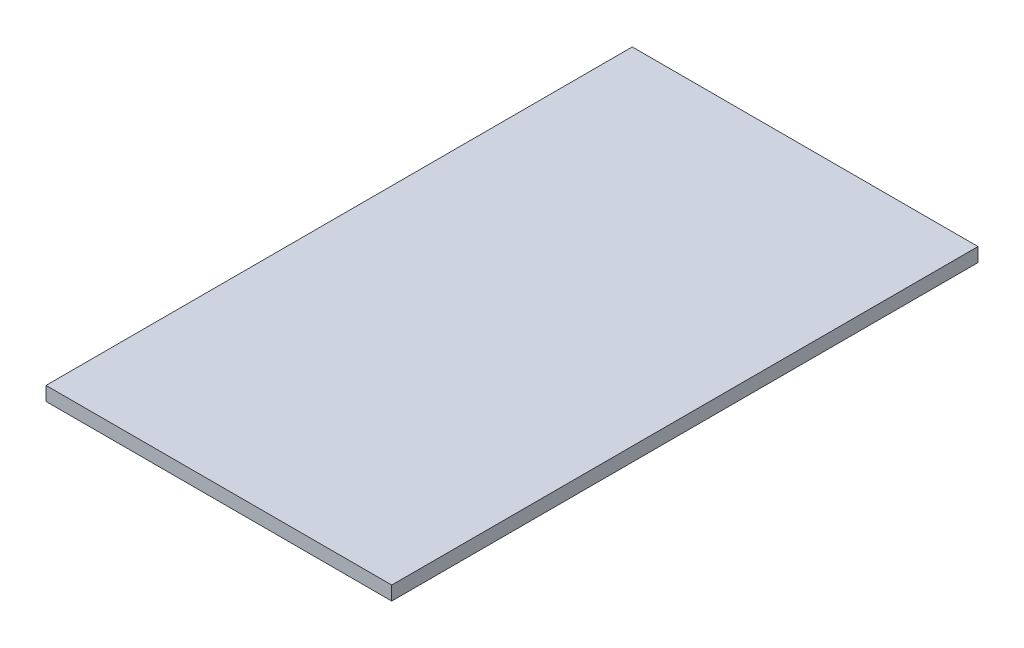
ISO-10303-21;
HEADER;
FILE_DESCRIPTION(('STEP AP214'),'2;1');
FILE_NAME('part.step','',(''),(''),'','','');
FILE_SCHEMA(('AUTOMOTIVE_DESIGN { 1 0 10303 214 1 1 1 1 }'));
ENDSEC;
DATA;
#1=APPLICATION_CONTEXT('core data for automotive mechanical design processes');
#2=APPLICATION_PROTOCOL_DEFINITION('international standard','automotive_design',2000,#1);
#3=PRODUCT_CONTEXT('',#1,'mechanical');
#4=PRODUCT('Part','Part','',(#3));
#5=PRODUCT_RELATED_PRODUCT_CATEGORY('part','',(#4));
#6=PRODUCT_DEFINITION_FORMATION('','',#4);
#7=PRODUCT_DEFINITION_CONTEXT('part definition',#1,'design');
#8=PRODUCT_DEFINITION('design','',#6,#7);
#9=PRODUCT_DEFINITION_SHAPE('','',#8);
#10=(LENGTH_UNIT() NAMED_UNIT(*) SI_UNIT(.MILLI.,.METRE.));
#11=(NAMED_UNIT(*) PLANE_ANGLE_UNIT() SI_UNIT($,.RADIAN.));
#12=(NAMED_UNIT(*) SI_UNIT($,.STERADIAN.) SOLID_ANGLE_UNIT());
#13=UNCERTAINTY_MEASURE_WITH_UNIT(LENGTH_MEASURE(1.E-05),#10,'distance_accuracy_value','');
#14=(GEOMETRIC_REPRESENTATION_CONTEXT(3) GLOBAL_UNCERTAINTY_ASSIGNED_CONTEXT((#13)) GLOBAL_UNIT_ASSIGNED_CONTEXT((#10,
#11,#12)) REPRESENTATION_CONTEXT('',''));
#15=CARTESIAN_POINT('',(0.,0.,0.));
#16=DIRECTION('',(0.,0.,1.));
#17=DIRECTION('',(1.,0.,0.));
#18=AXIS2_PLACEMENT_3D('',#15,#16,#17);
#19=CARTESIAN_POINT('',(24.3296303830655,6.35,0.));
#20=DIRECTION('',(1.,0.,0.));
#21=DIRECTION('',(0.,0.,-1.));
#22=AXIS2_PLACEMENT_3D('',#19,#20,#21);
#23=PLANE('',#22);
#24=DIRECTION('',(0.,0.,1.));
#25=VECTOR('',#24,1.);
#26=CARTESIAN_POINT('',(24.3296303830655,0.,0.));
#27=LINE('',#26,#25);
#28=CARTESIAN_POINT('',(24.3296303830655,0.,-267.462));
#29=VERTEX_POINT('',#28);
#30=CARTESIAN_POINT('',(24.3296303830655,0.,0.));
#31=VERTEX_POINT('',#30);
#32=EDGE_CURVE('E95',#29,#31,#27,.T.);
#33=ORIENTED_EDGE('',*,*,#32,.T.);
#34=DIRECTION('',(0.,-1.,0.));
#35=VECTOR('',#34,1.);
#36=CARTESIAN_POINT('',(24.3296303830655,6.35,0.));
#37=LINE('',#36,#35);
#38=CARTESIAN_POINT('',(24.3296303830655,6.35,0.));
#39=VERTEX_POINT('',#38);
#40=EDGE_CURVE('E11',#39,#31,#37,.T.);
#41=ORIENTED_EDGE('',*,*,#40,.F.);
#42=DIRECTION('',(0.,0.,1.));
#43=VECTOR('',#42,1.);
#44=CARTESIAN_POINT('',(24.3296303830655,6.35,0.));
#45=LINE('',#44,#43);
#46=CARTESIAN_POINT('',(24.3296303830655,6.35,-267.462));
#47=VERTEX_POINT('',#46);
#48=EDGE_CURVE('E83',#47,#39,#45,.T.);
#49=ORIENTED_EDGE('',*,*,#48,.F.);
#50=DIRECTION('',(0.,-1.,0.));
#51=VECTOR('',#50,1.);
#52=CARTESIAN_POINT('',(24.3296303830655,6.35,-267.462));
#53=LINE('',#52,#51);
#54=EDGE_CURVE('E91',#47,#29,#53,.T.);
#55=ORIENTED_EDGE('',*,*,#54,.T.);
#56=EDGE_LOOP('',(#33,#41,#49,#55));
#57=FACE_BOUND('',#56,.T.);
#58=ADVANCED_FACE('F32',(#57),#23,.F.);
#59=CARTESIAN_POINT('',(24.3296303830655,6.35,0.));
#60=DIRECTION('',(0.,0.,-1.));
#61=DIRECTION('',(-1.,0.,0.));
#62=AXIS2_PLACEMENT_3D('',#59,#60,#61);
#63=PLANE('',#62);
#64=DIRECTION('',(1.,0.,0.));
#65=VECTOR('',#64,1.);
#66=CARTESIAN_POINT('',(24.3296303830655,0.,0.));
#67=LINE('',#66,#65);
#68=CARTESIAN_POINT('',(182.063630383065,0.,0.));
#69=VERTEX_POINT('',#68);
#70=EDGE_CURVE('E87',#31,#69,#67,.T.);
#71=ORIENTED_EDGE('',*,*,#70,.T.);
#72=DIRECTION('',(0.,-1.,0.));
#73=VECTOR('',#72,1.);
#74=CARTESIAN_POINT('',(182.063630383065,6.35,0.));
#75=LINE('',#74,#73);
#76=CARTESIAN_POINT('',(182.063630383065,6.35,0.));
#77=VERTEX_POINT('',#76);
#78=EDGE_CURVE('E40',#77,#69,#75,.T.);
#79=ORIENTED_EDGE('',*,*,#78,.F.);
#80=DIRECTION('',(1.,0.,0.));
#81=VECTOR('',#80,1.);
#82=CARTESIAN_POINT('',(24.3296303830655,6.35,0.));
#83=LINE('',#82,#81);
#84=EDGE_CURVE('E78',#39,#77,#83,.T.);
#85=ORIENTED_EDGE('',*,*,#84,.F.);
#86=ORIENTED_EDGE('',*,*,#40,.T.);
#87=EDGE_LOOP('',(#71,#79,#85,#86));
#88=FACE_BOUND('',#87,.T.);
#89=ADVANCED_FACE('F86',(#88),#63,.F.);
#90=CARTESIAN_POINT('',(182.063630383065,6.35,0.));
#91=DIRECTION('',(-1.,0.,0.));
#92=DIRECTION('',(0.,0.,1.));
#93=AXIS2_PLACEMENT_3D('',#90,#91,#92);
#94=PLANE('',#93);
#95=DIRECTION('',(0.,0.,-1.));
#96=VECTOR('',#95,1.);
#97=CARTESIAN_POINT('',(182.063630383065,0.,0.));
#98=LINE('',#97,#96);
#99=CARTESIAN_POINT('',(182.063630383065,0.,-267.462));
#100=VERTEX_POINT('',#99);
#101=EDGE_CURVE('E65',#69,#100,#98,.T.);
#102=ORIENTED_EDGE('',*,*,#101,.T.);
#103=DIRECTION('',(0.,-1.,0.));
#104=VECTOR('',#103,1.);
#105=CARTESIAN_POINT('',(182.063630383065,6.35,-267.462));
#106=LINE('',#105,#104);
#107=CARTESIAN_POINT('',(182.063630383065,6.35,-267.462));
#108=VERTEX_POINT('',#107);
#109=EDGE_CURVE('E88',#108,#100,#106,.T.);
#110=ORIENTED_EDGE('',*,*,#109,.F.);
#111=DIRECTION('',(0.,0.,-1.));
#112=VECTOR('',#111,1.);
#113=CARTESIAN_POINT('',(182.063630383065,6.35,0.));
#114=LINE('',#113,#112);
#115=EDGE_CURVE('E81',#77,#108,#114,.T.);
#116=ORIENTED_EDGE('',*,*,#115,.F.);
#117=ORIENTED_EDGE('',*,*,#78,.T.);
#118=EDGE_LOOP('',(#102,#110,#116,#117));
#119=FACE_BOUND('',#118,.T.);
#120=ADVANCED_FACE('F89',(#119),#94,.F.);
#121=CARTESIAN_POINT('',(24.3296303830655,6.35,-267.462));
#122=DIRECTION('',(0.,0.,1.));
#123=DIRECTION('',(1.,0.,0.));
#124=AXIS2_PLACEMENT_3D('',#121,#122,#123);
#125=PLANE('',#124);
#126=DIRECTION('',(-1.,0.,0.));
#127=VECTOR('',#126,1.);
#128=CARTESIAN_POINT('',(24.3296303830655,0.,-267.462));
#129=LINE('',#128,#127);
#130=EDGE_CURVE('E71',#100,#29,#129,.T.);
#131=ORIENTED_EDGE('',*,*,#130,.T.);
#132=ORIENTED_EDGE('',*,*,#54,.F.);
#133=DIRECTION('',(-1.,0.,0.));
#134=VECTOR('',#133,1.);
#135=CARTESIAN_POINT('',(24.3296303830655,6.35,-267.462));
#136=LINE('',#135,#134);
#137=EDGE_CURVE('E48',#108,#47,#136,.T.);
#138=ORIENTED_EDGE('',*,*,#137,.F.);
#139=ORIENTED_EDGE('',*,*,#109,.T.);
#140=EDGE_LOOP('',(#131,#132,#138,#139));
#141=FACE_BOUND('',#140,.T.);
#142=ADVANCED_FACE('F102',(#141),#125,.F.);
#143=CARTESIAN_POINT('',(24.3296303830655,6.35,-267.462));
#144=DIRECTION('',(0.,-1.,0.));
#145=DIRECTION('',(0.,0.,-1.));
#146=AXIS2_PLACEMENT_3D('',#143,#144,#145);
#147=PLANE('',#146);
#148=ORIENTED_EDGE('',*,*,#48,.T.);
#149=ORIENTED_EDGE('',*,*,#84,.T.);
#150=ORIENTED_EDGE('',*,*,#115,.T.);
#151=ORIENTED_EDGE('',*,*,#137,.T.);
#152=EDGE_LOOP('',(#148,#149,#150,#151));
#153=FACE_BOUND('',#152,.T.);
#154=ADVANCED_FACE('F79',(#153),#147,.F.);
#155=CARTESIAN_POINT('',(24.3296303830655,0.,-267.462));
#156=DIRECTION('',(0.,-1.,0.));
#157=DIRECTION('',(0.,0.,-1.));
#158=AXIS2_PLACEMENT_3D('',#155,#156,#157);
#159=PLANE('',#158);
#160=ORIENTED_EDGE('',*,*,#32,.F.);
#161=ORIENTED_EDGE('',*,*,#130,.F.);
#162=ORIENTED_EDGE('',*,*,#101,.F.);
#163=ORIENTED_EDGE('',*,*,#70,.F.);
#164=EDGE_LOOP('',(#160,#161,#162,#163));
#165=FACE_BOUND('',#164,.T.);
#166=ADVANCED_FACE('F105',(#165),#159,.T.);
#167=CLOSED_SHELL('',(#58,#89,#120,#142,#154,#166));
#168=MANIFOLD_SOLID_BREP('B2',#167);
#169=ADVANCED_BREP_SHAPE_REPRESENTATION('',(#18,#168),#14);
#170=SHAPE_DEFINITION_REPRESENTATION(#9,#169);
ENDSEC;
END-ISO-10303-21;
